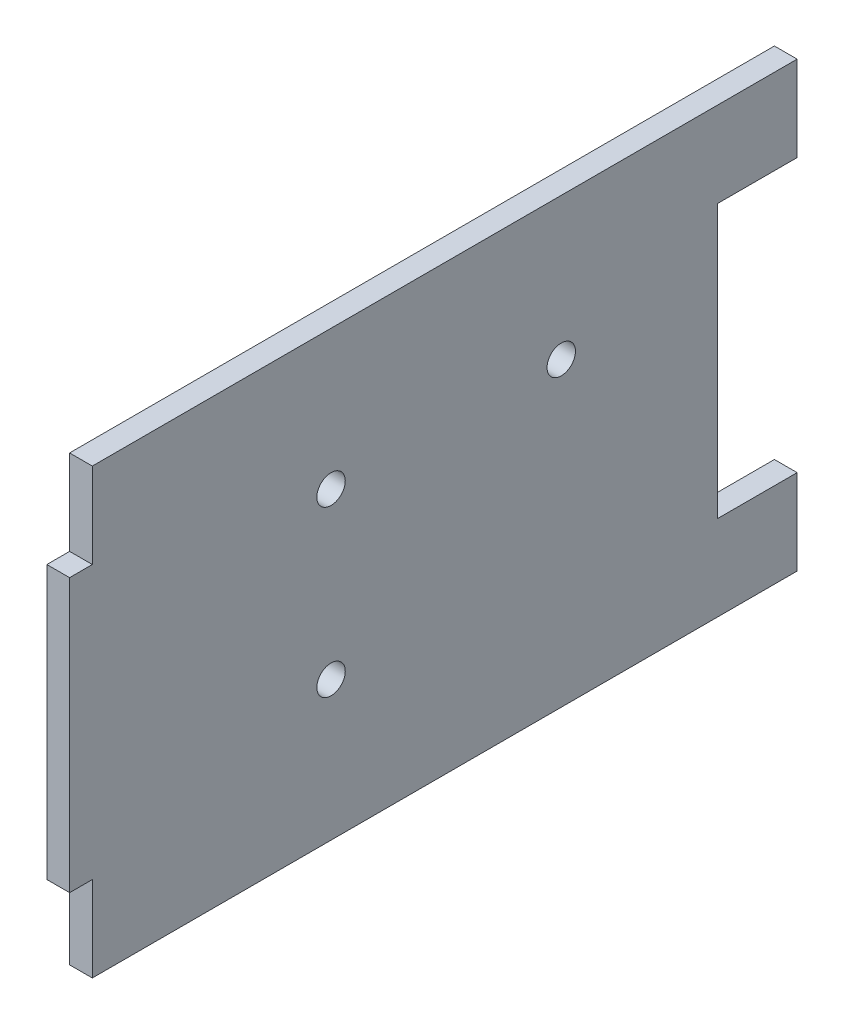
ISO-10303-21;
HEADER;
FILE_DESCRIPTION(('STEP AP214'),'2;1');
FILE_NAME('part.step','',(''),(''),'','','');
FILE_SCHEMA(('AUTOMOTIVE_DESIGN { 1 0 10303 214 1 1 1 1 }'));
ENDSEC;
DATA;
#1=APPLICATION_CONTEXT('core data for automotive mechanical design processes');
#2=APPLICATION_PROTOCOL_DEFINITION('international standard','automotive_design',2000,#1);
#3=PRODUCT_CONTEXT('',#1,'mechanical');
#4=PRODUCT('Part','Part','',(#3));
#5=PRODUCT_RELATED_PRODUCT_CATEGORY('part','',(#4));
#6=PRODUCT_DEFINITION_FORMATION('','',#4);
#7=PRODUCT_DEFINITION_CONTEXT('part definition',#1,'design');
#8=PRODUCT_DEFINITION('design','',#6,#7);
#9=PRODUCT_DEFINITION_SHAPE('','',#8);
#10=(LENGTH_UNIT() NAMED_UNIT(*) SI_UNIT(.MILLI.,.METRE.));
#11=(NAMED_UNIT(*) PLANE_ANGLE_UNIT() SI_UNIT($,.RADIAN.));
#12=(NAMED_UNIT(*) SI_UNIT($,.STERADIAN.) SOLID_ANGLE_UNIT());
#13=UNCERTAINTY_MEASURE_WITH_UNIT(LENGTH_MEASURE(1.E-05),#10,'distance_accuracy_value','');
#14=(GEOMETRIC_REPRESENTATION_CONTEXT(3) GLOBAL_UNCERTAINTY_ASSIGNED_CONTEXT((#13)) GLOBAL_UNIT_ASSIGNED_CONTEXT((#10,
#11,#12)) REPRESENTATION_CONTEXT('',''));
#15=CARTESIAN_POINT('',(0.,0.,0.));
#16=DIRECTION('',(0.,0.,1.));
#17=DIRECTION('',(1.,0.,0.));
#18=AXIS2_PLACEMENT_3D('',#15,#16,#17);
#19=CARTESIAN_POINT('',(4.,0.,0.));
#20=DIRECTION('',(0.,0.,-1.));
#21=DIRECTION('',(0.,1.,0.));
#22=AXIS2_PLACEMENT_3D('',#19,#20,#21);
#23=PLANE('',#22);
#24=DIRECTION('',(0.,-1.,0.));
#25=VECTOR('',#24,1.);
#26=CARTESIAN_POINT('',(0.,0.,0.));
#27=LINE('',#26,#25);
#28=CARTESIAN_POINT('',(0.,15.,0.));
#29=VERTEX_POINT('',#28);
#30=CARTESIAN_POINT('',(0.,0.,0.));
#31=VERTEX_POINT('',#30);
#32=EDGE_CURVE('E152',#29,#31,#27,.T.);
#33=ORIENTED_EDGE('',*,*,#32,.T.);
#34=DIRECTION('',(-1.,0.,0.));
#35=VECTOR('',#34,1.);
#36=CARTESIAN_POINT('',(4.,0.,0.));
#37=LINE('',#36,#35);
#38=CARTESIAN_POINT('',(4.,0.,0.));
#39=VERTEX_POINT('',#38);
#40=EDGE_CURVE('E11',#39,#31,#37,.T.);
#41=ORIENTED_EDGE('',*,*,#40,.F.);
#42=DIRECTION('',(0.,-1.,0.));
#43=VECTOR('',#42,1.);
#44=CARTESIAN_POINT('',(4.,0.,0.));
#45=LINE('',#44,#43);
#46=CARTESIAN_POINT('',(4.,15.,0.));
#47=VERTEX_POINT('',#46);
#48=EDGE_CURVE('E175',#47,#39,#45,.T.);
#49=ORIENTED_EDGE('',*,*,#48,.F.);
#50=DIRECTION('',(-1.,0.,0.));
#51=VECTOR('',#50,1.);
#52=CARTESIAN_POINT('',(4.,15.,0.));
#53=LINE('',#52,#51);
#54=EDGE_CURVE('E148',#47,#29,#53,.T.);
#55=ORIENTED_EDGE('',*,*,#54,.T.);
#56=EDGE_LOOP('',(#33,#41,#49,#55));
#57=FACE_BOUND('',#56,.T.);
#58=ADVANCED_FACE('F32',(#57),#23,.F.);
#59=CARTESIAN_POINT('',(4.,0.,0.));
#60=DIRECTION('',(0.,1.,0.));
#61=DIRECTION('',(0.,0.,1.));
#62=AXIS2_PLACEMENT_3D('',#59,#60,#61);
#63=PLANE('',#62);
#64=DIRECTION('',(0.,0.,-1.));
#65=VECTOR('',#64,1.);
#66=CARTESIAN_POINT('',(0.,0.,0.));
#67=LINE('',#66,#65);
#68=CARTESIAN_POINT('',(0.,0.,-124.));
#69=VERTEX_POINT('',#68);
#70=EDGE_CURVE('E155',#31,#69,#67,.T.);
#71=ORIENTED_EDGE('',*,*,#70,.T.);
#72=DIRECTION('',(-1.,0.,0.));
#73=VECTOR('',#72,1.);
#74=CARTESIAN_POINT('',(4.,0.,-124.));
#75=LINE('',#74,#73);
#76=CARTESIAN_POINT('',(4.,0.,-124.));
#77=VERTEX_POINT('',#76);
#78=EDGE_CURVE('E40',#77,#69,#75,.T.);
#79=ORIENTED_EDGE('',*,*,#78,.F.);
#80=DIRECTION('',(0.,0.,-1.));
#81=VECTOR('',#80,1.);
#82=CARTESIAN_POINT('',(4.,0.,0.));
#83=LINE('',#82,#81);
#84=EDGE_CURVE('E103',#39,#77,#83,.T.);
#85=ORIENTED_EDGE('',*,*,#84,.F.);
#86=ORIENTED_EDGE('',*,*,#40,.T.);
#87=EDGE_LOOP('',(#71,#79,#85,#86));
#88=FACE_BOUND('',#87,.T.);
#89=ADVANCED_FACE('F254',(#88),#63,.F.);
#90=CARTESIAN_POINT('',(4.,0.,-124.));
#91=DIRECTION('',(0.,0.,1.));
#92=DIRECTION('',(1.,0.,0.));
#93=AXIS2_PLACEMENT_3D('',#90,#91,#92);
#94=PLANE('',#93);
#95=DIRECTION('',(0.,1.,0.));
#96=VECTOR('',#95,1.);
#97=CARTESIAN_POINT('',(0.,0.,-124.));
#98=LINE('',#97,#96);
#99=CARTESIAN_POINT('',(0.,15.,-124.));
#100=VERTEX_POINT('',#99);
#101=EDGE_CURVE('E158',#69,#100,#98,.T.);
#102=ORIENTED_EDGE('',*,*,#101,.T.);
#103=DIRECTION('',(-1.,0.,0.));
#104=VECTOR('',#103,1.);
#105=CARTESIAN_POINT('',(4.,15.,-124.));
#106=LINE('',#105,#104);
#107=CARTESIAN_POINT('',(4.,15.,-124.));
#108=VERTEX_POINT('',#107);
#109=EDGE_CURVE('E194',#108,#100,#106,.T.);
#110=ORIENTED_EDGE('',*,*,#109,.F.);
#111=DIRECTION('',(0.,1.,0.));
#112=VECTOR('',#111,1.);
#113=CARTESIAN_POINT('',(4.,0.,-124.));
#114=LINE('',#113,#112);
#115=EDGE_CURVE('E202',#77,#108,#114,.T.);
#116=ORIENTED_EDGE('',*,*,#115,.F.);
#117=ORIENTED_EDGE('',*,*,#78,.T.);
#118=EDGE_LOOP('',(#102,#110,#116,#117));
#119=FACE_BOUND('',#118,.T.);
#120=ADVANCED_FACE('F200',(#119),#94,.F.);
#121=CARTESIAN_POINT('',(4.,15.,-124.));
#122=DIRECTION('',(0.,-1.,0.));
#123=DIRECTION('',(0.,0.,-1.));
#124=AXIS2_PLACEMENT_3D('',#121,#122,#123);
#125=PLANE('',#124);
#126=DIRECTION('',(0.,0.,1.));
#127=VECTOR('',#126,1.);
#128=CARTESIAN_POINT('',(0.,15.,-124.));
#129=LINE('',#128,#127);
#130=CARTESIAN_POINT('',(0.,15.,-110.));
#131=VERTEX_POINT('',#130);
#132=EDGE_CURVE('E160',#100,#131,#129,.T.);
#133=ORIENTED_EDGE('',*,*,#132,.T.);
#134=DIRECTION('',(-1.,0.,0.));
#135=VECTOR('',#134,1.);
#136=CARTESIAN_POINT('',(4.,15.,-110.));
#137=LINE('',#136,#135);
#138=CARTESIAN_POINT('',(4.,15.,-110.));
#139=VERTEX_POINT('',#138);
#140=EDGE_CURVE('E191',#139,#131,#137,.T.);
#141=ORIENTED_EDGE('',*,*,#140,.F.);
#142=DIRECTION('',(0.,0.,1.));
#143=VECTOR('',#142,1.);
#144=CARTESIAN_POINT('',(4.,15.,-124.));
#145=LINE('',#144,#143);
#146=EDGE_CURVE('E220',#108,#139,#145,.T.);
#147=ORIENTED_EDGE('',*,*,#146,.F.);
#148=ORIENTED_EDGE('',*,*,#109,.T.);
#149=EDGE_LOOP('',(#133,#141,#147,#148));
#150=FACE_BOUND('',#149,.T.);
#151=ADVANCED_FACE('F211',(#150),#125,.F.);
#152=CARTESIAN_POINT('',(4.,63.,-110.));
#153=DIRECTION('',(0.,0.,1.));
#154=DIRECTION('',(1.,0.,0.));
#155=AXIS2_PLACEMENT_3D('',#152,#153,#154);
#156=PLANE('',#155);
#157=DIRECTION('',(0.,1.,0.));
#158=VECTOR('',#157,1.);
#159=CARTESIAN_POINT('',(0.,63.,-110.));
#160=LINE('',#159,#158);
#161=CARTESIAN_POINT('',(0.,63.,-110.));
#162=VERTEX_POINT('',#161);
#163=EDGE_CURVE('E162',#131,#162,#160,.T.);
#164=ORIENTED_EDGE('',*,*,#163,.T.);
#165=DIRECTION('',(-1.,0.,0.));
#166=VECTOR('',#165,1.);
#167=CARTESIAN_POINT('',(4.,63.,-110.));
#168=LINE('',#167,#166);
#169=CARTESIAN_POINT('',(4.,63.,-110.));
#170=VERTEX_POINT('',#169);
#171=EDGE_CURVE('E188',#170,#162,#168,.T.);
#172=ORIENTED_EDGE('',*,*,#171,.F.);
#173=DIRECTION('',(0.,1.,0.));
#174=VECTOR('',#173,1.);
#175=CARTESIAN_POINT('',(4.,63.,-110.));
#176=LINE('',#175,#174);
#177=EDGE_CURVE('E217',#139,#170,#176,.T.);
#178=ORIENTED_EDGE('',*,*,#177,.F.);
#179=ORIENTED_EDGE('',*,*,#140,.T.);
#180=EDGE_LOOP('',(#164,#172,#178,#179));
#181=FACE_BOUND('',#180,.T.);
#182=ADVANCED_FACE('F215',(#181),#156,.F.);
#183=CARTESIAN_POINT('',(4.,63.,-124.));
#184=DIRECTION('',(0.,1.,0.));
#185=DIRECTION('',(0.,0.,1.));
#186=AXIS2_PLACEMENT_3D('',#183,#184,#185);
#187=PLANE('',#186);
#188=DIRECTION('',(0.,0.,-1.));
#189=VECTOR('',#188,1.);
#190=CARTESIAN_POINT('',(0.,63.,-124.));
#191=LINE('',#190,#189);
#192=CARTESIAN_POINT('',(0.,63.,-124.));
#193=VERTEX_POINT('',#192);
#194=EDGE_CURVE('E164',#162,#193,#191,.T.);
#195=ORIENTED_EDGE('',*,*,#194,.T.);
#196=DIRECTION('',(-1.,0.,0.));
#197=VECTOR('',#196,1.);
#198=CARTESIAN_POINT('',(4.,63.,-124.));
#199=LINE('',#198,#197);
#200=CARTESIAN_POINT('',(4.,63.,-124.));
#201=VERTEX_POINT('',#200);
#202=EDGE_CURVE('E185',#201,#193,#199,.T.);
#203=ORIENTED_EDGE('',*,*,#202,.F.);
#204=DIRECTION('',(0.,0.,-1.));
#205=VECTOR('',#204,1.);
#206=CARTESIAN_POINT('',(4.,63.,-124.));
#207=LINE('',#206,#205);
#208=EDGE_CURVE('E219',#170,#201,#207,.T.);
#209=ORIENTED_EDGE('',*,*,#208,.F.);
#210=ORIENTED_EDGE('',*,*,#171,.T.);
#211=EDGE_LOOP('',(#195,#203,#209,#210));
#212=FACE_BOUND('',#211,.T.);
#213=ADVANCED_FACE('F267',(#212),#187,.F.);
#214=CARTESIAN_POINT('',(4.,63.,-124.));
#215=DIRECTION('',(0.,0.,1.));
#216=DIRECTION('',(1.,0.,0.));
#217=AXIS2_PLACEMENT_3D('',#214,#215,#216);
#218=PLANE('',#217);
#219=DIRECTION('',(0.,1.,0.));
#220=VECTOR('',#219,1.);
#221=CARTESIAN_POINT('',(0.,63.,-124.));
#222=LINE('',#221,#220);
#223=CARTESIAN_POINT('',(0.,78.,-124.));
#224=VERTEX_POINT('',#223);
#225=EDGE_CURVE('E166',#193,#224,#222,.T.);
#226=ORIENTED_EDGE('',*,*,#225,.T.);
#227=DIRECTION('',(-1.,0.,0.));
#228=VECTOR('',#227,1.);
#229=CARTESIAN_POINT('',(4.,78.,-124.));
#230=LINE('',#229,#228);
#231=CARTESIAN_POINT('',(4.,78.,-124.));
#232=VERTEX_POINT('',#231);
#233=EDGE_CURVE('E182',#232,#224,#230,.T.);
#234=ORIENTED_EDGE('',*,*,#233,.F.);
#235=DIRECTION('',(0.,1.,0.));
#236=VECTOR('',#235,1.);
#237=CARTESIAN_POINT('',(4.,63.,-124.));
#238=LINE('',#237,#236);
#239=EDGE_CURVE('E222',#201,#232,#238,.T.);
#240=ORIENTED_EDGE('',*,*,#239,.F.);
#241=ORIENTED_EDGE('',*,*,#202,.T.);
#242=EDGE_LOOP('',(#226,#234,#240,#241));
#243=FACE_BOUND('',#242,.T.);
#244=ADVANCED_FACE('F270',(#243),#218,.F.);
#245=CARTESIAN_POINT('',(4.,78.,0.));
#246=DIRECTION('',(0.,-1.,0.));
#247=DIRECTION('',(0.,0.,-1.));
#248=AXIS2_PLACEMENT_3D('',#245,#246,#247);
#249=PLANE('',#248);
#250=DIRECTION('',(0.,0.,1.));
#251=VECTOR('',#250,1.);
#252=CARTESIAN_POINT('',(0.,78.,0.));
#253=LINE('',#252,#251);
#254=CARTESIAN_POINT('',(0.,78.,0.));
#255=VERTEX_POINT('',#254);
#256=EDGE_CURVE('E168',#224,#255,#253,.T.);
#257=ORIENTED_EDGE('',*,*,#256,.T.);
#258=DIRECTION('',(-1.,0.,0.));
#259=VECTOR('',#258,1.);
#260=CARTESIAN_POINT('',(4.,78.,0.));
#261=LINE('',#260,#259);
#262=CARTESIAN_POINT('',(4.,78.,0.));
#263=VERTEX_POINT('',#262);
#264=EDGE_CURVE('E179',#263,#255,#261,.T.);
#265=ORIENTED_EDGE('',*,*,#264,.F.);
#266=DIRECTION('',(0.,0.,1.));
#267=VECTOR('',#266,1.);
#268=CARTESIAN_POINT('',(4.,78.,0.));
#269=LINE('',#268,#267);
#270=EDGE_CURVE('E228',#232,#263,#269,.T.);
#271=ORIENTED_EDGE('',*,*,#270,.F.);
#272=ORIENTED_EDGE('',*,*,#233,.T.);
#273=EDGE_LOOP('',(#257,#265,#271,#272));
#274=FACE_BOUND('',#273,.T.);
#275=ADVANCED_FACE('F234',(#274),#249,.F.);
#276=CARTESIAN_POINT('',(4.,63.,0.));
#277=DIRECTION('',(0.,0.,-1.));
#278=DIRECTION('',(0.,1.,0.));
#279=AXIS2_PLACEMENT_3D('',#276,#277,#278);
#280=PLANE('',#279);
#281=DIRECTION('',(0.,-1.,0.));
#282=VECTOR('',#281,1.);
#283=CARTESIAN_POINT('',(0.,63.,0.));
#284=LINE('',#283,#282);
#285=CARTESIAN_POINT('',(0.,63.,0.));
#286=VERTEX_POINT('',#285);
#287=EDGE_CURVE('E170',#255,#286,#284,.T.);
#288=ORIENTED_EDGE('',*,*,#287,.T.);
#289=DIRECTION('',(-1.,0.,0.));
#290=VECTOR('',#289,1.);
#291=CARTESIAN_POINT('',(4.,63.,0.));
#292=LINE('',#291,#290);
#293=CARTESIAN_POINT('',(4.,63.,0.));
#294=VERTEX_POINT('',#293);
#295=EDGE_CURVE('E143',#294,#286,#292,.T.);
#296=ORIENTED_EDGE('',*,*,#295,.F.);
#297=DIRECTION('',(0.,-1.,0.));
#298=VECTOR('',#297,1.);
#299=CARTESIAN_POINT('',(4.,63.,0.));
#300=LINE('',#299,#298);
#301=EDGE_CURVE('E134',#263,#294,#300,.T.);
#302=ORIENTED_EDGE('',*,*,#301,.F.);
#303=ORIENTED_EDGE('',*,*,#264,.T.);
#304=EDGE_LOOP('',(#288,#296,#302,#303));
#305=FACE_BOUND('',#304,.T.);
#306=ADVANCED_FACE('F238',(#305),#280,.F.);
#307=CARTESIAN_POINT('',(4.,63.,0.));
#308=DIRECTION('',(0.,-1.,0.));
#309=DIRECTION('',(0.,0.,-1.));
#310=AXIS2_PLACEMENT_3D('',#307,#308,#309);
#311=PLANE('',#310);
#312=DIRECTION('',(0.,0.,1.));
#313=VECTOR('',#312,1.);
#314=CARTESIAN_POINT('',(0.,63.,0.));
#315=LINE('',#314,#313);
#316=CARTESIAN_POINT('',(0.,63.,4.));
#317=VERTEX_POINT('',#316);
#318=EDGE_CURVE('E142',#286,#317,#315,.T.);
#319=ORIENTED_EDGE('',*,*,#318,.T.);
#320=DIRECTION('',(-1.,0.,0.));
#321=VECTOR('',#320,1.);
#322=CARTESIAN_POINT('',(4.,63.,4.));
#323=LINE('',#322,#321);
#324=CARTESIAN_POINT('',(4.,63.,4.));
#325=VERTEX_POINT('',#324);
#326=EDGE_CURVE('E139',#325,#317,#323,.T.);
#327=ORIENTED_EDGE('',*,*,#326,.F.);
#328=DIRECTION('',(0.,0.,1.));
#329=VECTOR('',#328,1.);
#330=CARTESIAN_POINT('',(4.,63.,0.));
#331=LINE('',#330,#329);
#332=EDGE_CURVE('E128',#294,#325,#331,.T.);
#333=ORIENTED_EDGE('',*,*,#332,.F.);
#334=ORIENTED_EDGE('',*,*,#295,.T.);
#335=EDGE_LOOP('',(#319,#327,#333,#334));
#336=FACE_BOUND('',#335,.T.);
#337=ADVANCED_FACE('F140',(#336),#311,.F.);
#338=CARTESIAN_POINT('',(4.,63.,4.));
#339=DIRECTION('',(0.,0.,-1.));
#340=DIRECTION('',(0.,1.,0.));
#341=AXIS2_PLACEMENT_3D('',#338,#339,#340);
#342=PLANE('',#341);
#343=DIRECTION('',(0.,-1.,0.));
#344=VECTOR('',#343,1.);
#345=CARTESIAN_POINT('',(0.,63.,4.));
#346=LINE('',#345,#344);
#347=CARTESIAN_POINT('',(0.,15.,3.99999999999999));
#348=VERTEX_POINT('',#347);
#349=EDGE_CURVE('E89',#317,#348,#346,.T.);
#350=ORIENTED_EDGE('',*,*,#349,.T.);
#351=DIRECTION('',(-1.,0.,0.));
#352=VECTOR('',#351,1.);
#353=CARTESIAN_POINT('',(4.,15.,3.99999999999999));
#354=LINE('',#353,#352);
#355=CARTESIAN_POINT('',(4.,15.,3.99999999999999));
#356=VERTEX_POINT('',#355);
#357=EDGE_CURVE('E144',#356,#348,#354,.T.);
#358=ORIENTED_EDGE('',*,*,#357,.F.);
#359=DIRECTION('',(0.,-1.,0.));
#360=VECTOR('',#359,1.);
#361=CARTESIAN_POINT('',(4.,63.,4.));
#362=LINE('',#361,#360);
#363=EDGE_CURVE('E132',#325,#356,#362,.T.);
#364=ORIENTED_EDGE('',*,*,#363,.F.);
#365=ORIENTED_EDGE('',*,*,#326,.T.);
#366=EDGE_LOOP('',(#350,#358,#364,#365));
#367=FACE_BOUND('',#366,.T.);
#368=ADVANCED_FACE('F146',(#367),#342,.F.);
#369=CARTESIAN_POINT('',(4.,15.,0.));
#370=DIRECTION('',(0.,1.,0.));
#371=DIRECTION('',(0.,0.,1.));
#372=AXIS2_PLACEMENT_3D('',#369,#370,#371);
#373=PLANE('',#372);
#374=DIRECTION('',(0.,0.,-1.));
#375=VECTOR('',#374,1.);
#376=CARTESIAN_POINT('',(0.,15.,0.));
#377=LINE('',#376,#375);
#378=EDGE_CURVE('E95',#348,#29,#377,.T.);
#379=ORIENTED_EDGE('',*,*,#378,.T.);
#380=ORIENTED_EDGE('',*,*,#54,.F.);
#381=DIRECTION('',(0.,0.,-1.));
#382=VECTOR('',#381,1.);
#383=CARTESIAN_POINT('',(4.,15.,0.));
#384=LINE('',#383,#382);
#385=EDGE_CURVE('E48',#356,#47,#384,.T.);
#386=ORIENTED_EDGE('',*,*,#385,.F.);
#387=ORIENTED_EDGE('',*,*,#357,.T.);
#388=EDGE_LOOP('',(#379,#380,#386,#387));
#389=FACE_BOUND('',#388,.T.);
#390=ADVANCED_FACE('F242',(#389),#373,.F.);
#391=CARTESIAN_POINT('',(4.,0.,0.));
#392=DIRECTION('',(1.,0.,0.));
#393=DIRECTION('',(0.,0.,-1.));
#394=AXIS2_PLACEMENT_3D('',#391,#392,#393);
#395=PLANE('',#394);
#396=CARTESIAN_POINT('',(4.,53.5,-42.));
#397=DIRECTION('',(1.,0.,0.));
#398=DIRECTION('',(0.,0.,-1.));
#399=AXIS2_PLACEMENT_3D('',#396,#397,#398);
#400=CIRCLE('',#399,2.5);
#401=CARTESIAN_POINT('',(4.,53.5,-44.5));
#402=VERTEX_POINT('',#401);
#403=EDGE_CURVE('E346',#402,#402,#400,.T.);
#404=ORIENTED_EDGE('',*,*,#403,.F.);
#405=EDGE_LOOP('',(#404));
#406=FACE_BOUND('',#405,.T.);
#407=CARTESIAN_POINT('',(4.,53.,-82.5));
#408=DIRECTION('',(1.,0.,0.));
#409=DIRECTION('',(0.,0.,-1.));
#410=AXIS2_PLACEMENT_3D('',#407,#408,#409);
#411=CIRCLE('',#410,2.5);
#412=CARTESIAN_POINT('',(4.,53.,-85.));
#413=VERTEX_POINT('',#412);
#414=EDGE_CURVE('E352',#413,#413,#411,.T.);
#415=ORIENTED_EDGE('',*,*,#414,.F.);
#416=EDGE_LOOP('',(#415));
#417=FACE_BOUND('',#416,.T.);
#418=CARTESIAN_POINT('',(4.,24.5,-42.));
#419=DIRECTION('',(1.,0.,0.));
#420=DIRECTION('',(0.,0.,-1.));
#421=AXIS2_PLACEMENT_3D('',#418,#419,#420);
#422=CIRCLE('',#421,2.5);
#423=CARTESIAN_POINT('',(4.,24.5,-44.5));
#424=VERTEX_POINT('',#423);
#425=EDGE_CURVE('E349',#424,#424,#422,.T.);
#426=ORIENTED_EDGE('',*,*,#425,.F.);
#427=EDGE_LOOP('',(#426));
#428=FACE_BOUND('',#427,.T.);
#429=ORIENTED_EDGE('',*,*,#48,.T.);
#430=ORIENTED_EDGE('',*,*,#84,.T.);
#431=ORIENTED_EDGE('',*,*,#115,.T.);
#432=ORIENTED_EDGE('',*,*,#146,.T.);
#433=ORIENTED_EDGE('',*,*,#177,.T.);
#434=ORIENTED_EDGE('',*,*,#208,.T.);
#435=ORIENTED_EDGE('',*,*,#239,.T.);
#436=ORIENTED_EDGE('',*,*,#270,.T.);
#437=ORIENTED_EDGE('',*,*,#301,.T.);
#438=ORIENTED_EDGE('',*,*,#332,.T.);
#439=ORIENTED_EDGE('',*,*,#363,.T.);
#440=ORIENTED_EDGE('',*,*,#385,.T.);
#441=EDGE_LOOP('',(#429,#430,#431,#432,#433,#434,#435,#436,#437,#438,#439,#440));
#442=FACE_BOUND('',#441,.T.);
#443=ADVANCED_FACE('F130',(#406,#417,#428,#442),#395,.T.);
#444=CARTESIAN_POINT('',(0.,0.,0.));
#445=DIRECTION('',(1.,0.,0.));
#446=DIRECTION('',(0.,0.,-1.));
#447=AXIS2_PLACEMENT_3D('',#444,#445,#446);
#448=PLANE('',#447);
#449=CARTESIAN_POINT('',(0.,53.5,-42.));
#450=DIRECTION('',(1.,0.,0.));
#451=DIRECTION('',(0.,0.,-1.));
#452=AXIS2_PLACEMENT_3D('',#449,#450,#451);
#453=CIRCLE('',#452,2.5);
#454=CARTESIAN_POINT('',(0.,53.5,-44.5));
#455=VERTEX_POINT('',#454);
#456=EDGE_CURVE('E343',#455,#455,#453,.T.);
#457=ORIENTED_EDGE('',*,*,#456,.T.);
#458=EDGE_LOOP('',(#457));
#459=FACE_BOUND('',#458,.T.);
#460=CARTESIAN_POINT('',(0.,53.,-82.5));
#461=DIRECTION('',(1.,0.,0.));
#462=DIRECTION('',(0.,0.,-1.));
#463=AXIS2_PLACEMENT_3D('',#460,#461,#462);
#464=CIRCLE('',#463,2.5);
#465=CARTESIAN_POINT('',(0.,53.,-85.));
#466=VERTEX_POINT('',#465);
#467=EDGE_CURVE('E347',#466,#466,#464,.T.);
#468=ORIENTED_EDGE('',*,*,#467,.T.);
#469=EDGE_LOOP('',(#468));
#470=FACE_BOUND('',#469,.T.);
#471=CARTESIAN_POINT('',(0.,24.5,-42.));
#472=DIRECTION('',(1.,0.,0.));
#473=DIRECTION('',(0.,0.,-1.));
#474=AXIS2_PLACEMENT_3D('',#471,#472,#473);
#475=CIRCLE('',#474,2.5);
#476=CARTESIAN_POINT('',(0.,24.5,-44.5));
#477=VERTEX_POINT('',#476);
#478=EDGE_CURVE('E156',#477,#477,#475,.T.);
#479=ORIENTED_EDGE('',*,*,#478,.T.);
#480=EDGE_LOOP('',(#479));
#481=FACE_BOUND('',#480,.T.);
#482=ORIENTED_EDGE('',*,*,#32,.F.);
#483=ORIENTED_EDGE('',*,*,#378,.F.);
#484=ORIENTED_EDGE('',*,*,#349,.F.);
#485=ORIENTED_EDGE('',*,*,#318,.F.);
#486=ORIENTED_EDGE('',*,*,#287,.F.);
#487=ORIENTED_EDGE('',*,*,#256,.F.);
#488=ORIENTED_EDGE('',*,*,#225,.F.);
#489=ORIENTED_EDGE('',*,*,#194,.F.);
#490=ORIENTED_EDGE('',*,*,#163,.F.);
#491=ORIENTED_EDGE('',*,*,#132,.F.);
#492=ORIENTED_EDGE('',*,*,#101,.F.);
#493=ORIENTED_EDGE('',*,*,#70,.F.);
#494=EDGE_LOOP('',(#482,#483,#484,#485,#486,#487,#488,#489,#490,#491,#492,#493));
#495=FACE_BOUND('',#494,.T.);
#496=ADVANCED_FACE('F206',(#459,#470,#481,#495),#448,.F.);
#497=CARTESIAN_POINT('',(0.,24.5,-42.));
#498=DIRECTION('',(1.,0.,0.));
#499=DIRECTION('',(0.,0.,-1.));
#500=AXIS2_PLACEMENT_3D('',#497,#498,#499);
#501=CYLINDRICAL_SURFACE('',#500,2.5);
#502=ORIENTED_EDGE('',*,*,#478,.F.);
#503=EDGE_LOOP('',(#502));
#504=FACE_BOUND('',#503,.T.);
#505=ORIENTED_EDGE('',*,*,#425,.T.);
#506=EDGE_LOOP('',(#505));
#507=FACE_BOUND('',#506,.T.);
#508=ADVANCED_FACE('F307',(#504,#507),#501,.F.);
#509=CARTESIAN_POINT('',(0.,53.,-82.5));
#510=DIRECTION('',(1.,0.,0.));
#511=DIRECTION('',(0.,0.,-1.));
#512=AXIS2_PLACEMENT_3D('',#509,#510,#511);
#513=CYLINDRICAL_SURFACE('',#512,2.5);
#514=ORIENTED_EDGE('',*,*,#467,.F.);
#515=EDGE_LOOP('',(#514));
#516=FACE_BOUND('',#515,.T.);
#517=ORIENTED_EDGE('',*,*,#414,.T.);
#518=EDGE_LOOP('',(#517));
#519=FACE_BOUND('',#518,.T.);
#520=ADVANCED_FACE('F316',(#516,#519),#513,.F.);
#521=CARTESIAN_POINT('',(0.,53.5,-42.));
#522=DIRECTION('',(1.,0.,0.));
#523=DIRECTION('',(0.,0.,-1.));
#524=AXIS2_PLACEMENT_3D('',#521,#522,#523);
#525=CYLINDRICAL_SURFACE('',#524,2.5);
#526=ORIENTED_EDGE('',*,*,#456,.F.);
#527=EDGE_LOOP('',(#526));
#528=FACE_BOUND('',#527,.T.);
#529=ORIENTED_EDGE('',*,*,#403,.T.);
#530=EDGE_LOOP('',(#529));
#531=FACE_BOUND('',#530,.T.);
#532=ADVANCED_FACE('F326',(#528,#531),#525,.F.);
#533=CLOSED_SHELL('',(#58,#89,#120,#151,#182,#213,#244,#275,#306,#337,#368,#390,#443,#496,#508,
#520,#532));
#534=MANIFOLD_SOLID_BREP('B2',#533);
#535=ADVANCED_BREP_SHAPE_REPRESENTATION('',(#18,#534),#14);
#536=SHAPE_DEFINITION_REPRESENTATION(#9,#535);
ENDSEC;
END-ISO-10303-21;
